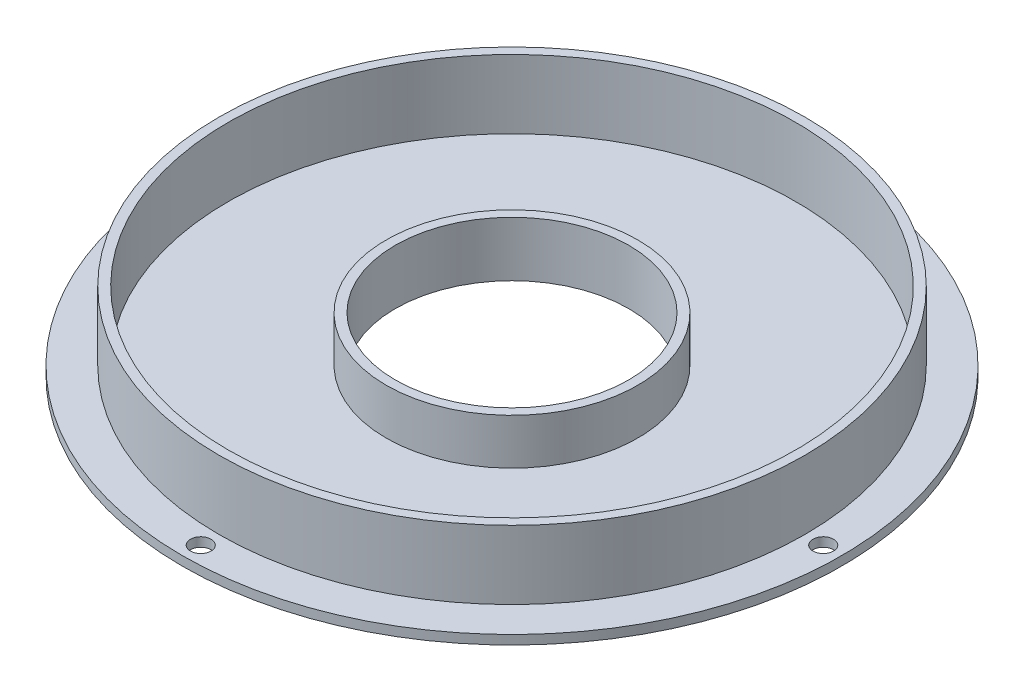
ISO-10303-21;
HEADER;
FILE_DESCRIPTION(('STEP AP214'),'2;1');
FILE_NAME('part.step','',(''),(''),'','','');
FILE_SCHEMA(('AUTOMOTIVE_DESIGN { 1 0 10303 214 1 1 1 1 }'));
ENDSEC;
DATA;
#1=APPLICATION_CONTEXT('core data for automotive mechanical design processes');
#2=APPLICATION_PROTOCOL_DEFINITION('international standard','automotive_design',2000,#1);
#3=PRODUCT_CONTEXT('',#1,'mechanical');
#4=PRODUCT('Part','Part','',(#3));
#5=PRODUCT_RELATED_PRODUCT_CATEGORY('part','',(#4));
#6=PRODUCT_DEFINITION_FORMATION('','',#4);
#7=PRODUCT_DEFINITION_CONTEXT('part definition',#1,'design');
#8=PRODUCT_DEFINITION('design','',#6,#7);
#9=PRODUCT_DEFINITION_SHAPE('','',#8);
#10=(LENGTH_UNIT() NAMED_UNIT(*) SI_UNIT(.MILLI.,.METRE.));
#11=(NAMED_UNIT(*) PLANE_ANGLE_UNIT() SI_UNIT($,.RADIAN.));
#12=(NAMED_UNIT(*) SI_UNIT($,.STERADIAN.) SOLID_ANGLE_UNIT());
#13=UNCERTAINTY_MEASURE_WITH_UNIT(LENGTH_MEASURE(1.E-05),#10,'distance_accuracy_value','');
#14=(GEOMETRIC_REPRESENTATION_CONTEXT(3) GLOBAL_UNCERTAINTY_ASSIGNED_CONTEXT((#13)) GLOBAL_UNIT_ASSIGNED_CONTEXT((#10,
#11,#12)) REPRESENTATION_CONTEXT('',''));
#15=CARTESIAN_POINT('',(0.,0.,0.));
#16=DIRECTION('',(0.,0.,1.));
#17=DIRECTION('',(1.,0.,0.));
#18=AXIS2_PLACEMENT_3D('',#15,#16,#17);
#19=CARTESIAN_POINT('',(0.,2.,0.));
#20=DIRECTION('',(0.,1.,0.));
#21=DIRECTION('',(0.,0.,1.));
#22=AXIS2_PLACEMENT_3D('',#19,#20,#21);
#23=PLANE('',#22);
#24=CARTESIAN_POINT('',(0.,2.,0.));
#25=DIRECTION('',(0.,1.,0.));
#26=DIRECTION('',(0.,0.,1.));
#27=AXIS2_PLACEMENT_3D('',#24,#25,#26);
#28=CIRCLE('',#27,27.5);
#29=CARTESIAN_POINT('',(0.,2.,27.5));
#30=VERTEX_POINT('',#29);
#31=EDGE_CURVE('E94',#30,#30,#28,.T.);
#32=ORIENTED_EDGE('',*,*,#31,.F.);
#33=EDGE_LOOP('',(#32));
#34=FACE_BOUND('',#33,.T.);
#35=CARTESIAN_POINT('',(0.,2.,0.));
#36=DIRECTION('',(0.,1.,0.));
#37=DIRECTION('',(0.,0.,1.));
#38=AXIS2_PLACEMENT_3D('',#35,#36,#37);
#39=CIRCLE('',#38,62.);
#40=CARTESIAN_POINT('',(0.,2.,62.));
#41=VERTEX_POINT('',#40);
#42=EDGE_CURVE('E10',#41,#41,#39,.F.);
#43=ORIENTED_EDGE('',*,*,#42,.F.);
#44=EDGE_LOOP('',(#43));
#45=FACE_BOUND('',#44,.T.);
#46=ADVANCED_FACE('F37',(#34,#45),#23,.T.);
#47=CARTESIAN_POINT('',(0.,2.,0.));
#48=DIRECTION('',(0.,1.,0.));
#49=DIRECTION('',(0.,0.,1.));
#50=AXIS2_PLACEMENT_3D('',#47,#48,#49);
#51=CIRCLE('',#50,64.);
#52=CARTESIAN_POINT('',(0.,2.,64.));
#53=VERTEX_POINT('',#52);
#54=EDGE_CURVE('E106',#53,#53,#51,.T.);
#55=ORIENTED_EDGE('',*,*,#54,.F.);
#56=EDGE_LOOP('',(#55));
#57=FACE_BOUND('',#56,.T.);
#58=CARTESIAN_POINT('',(7.12262193123999E-13,2.,-68.));
#59=DIRECTION('',(0.,1.,0.));
#60=DIRECTION('',(0.,0.,1.));
#61=AXIS2_PLACEMENT_3D('',#58,#59,#60);
#62=CIRCLE('',#61,2.24999999999999);
#63=CARTESIAN_POINT('',(7.12262193123999E-13,2.,-65.75));
#64=VERTEX_POINT('',#63);
#65=EDGE_CURVE('E82',#64,#64,#62,.T.);
#66=ORIENTED_EDGE('',*,*,#65,.F.);
#67=EDGE_LOOP('',(#66));
#68=FACE_BOUND('',#67,.T.);
#69=CARTESIAN_POINT('',(-2.37420731041333E-13,2.,68.));
#70=DIRECTION('',(0.,1.,0.));
#71=DIRECTION('',(0.,0.,1.));
#72=AXIS2_PLACEMENT_3D('',#69,#70,#71);
#73=CIRCLE('',#72,2.24999999999999);
#74=CARTESIAN_POINT('',(-2.37420731041333E-13,2.,70.25));
#75=VERTEX_POINT('',#74);
#76=EDGE_CURVE('E69',#75,#75,#73,.T.);
#77=ORIENTED_EDGE('',*,*,#76,.F.);
#78=EDGE_LOOP('',(#77));
#79=FACE_BOUND('',#78,.T.);
#80=CARTESIAN_POINT('',(68.,2.,0.));
#81=DIRECTION('',(0.,1.,0.));
#82=DIRECTION('',(0.,0.,1.));
#83=AXIS2_PLACEMENT_3D('',#80,#81,#82);
#84=CIRCLE('',#83,2.25);
#85=CARTESIAN_POINT('',(68.,2.,2.25));
#86=VERTEX_POINT('',#85);
#87=EDGE_CURVE('E56',#86,#86,#84,.T.);
#88=ORIENTED_EDGE('',*,*,#87,.F.);
#89=EDGE_LOOP('',(#88));
#90=FACE_BOUND('',#89,.T.);
#91=CARTESIAN_POINT('',(0.,2.,0.));
#92=DIRECTION('',(0.,1.,0.));
#93=DIRECTION('',(0.,0.,1.));
#94=AXIS2_PLACEMENT_3D('',#91,#92,#93);
#95=CIRCLE('',#94,72.);
#96=CARTESIAN_POINT('',(0.,2.,72.));
#97=VERTEX_POINT('',#96);
#98=EDGE_CURVE('E45',#97,#97,#95,.T.);
#99=ORIENTED_EDGE('',*,*,#98,.T.);
#100=EDGE_LOOP('',(#99));
#101=FACE_BOUND('',#100,.T.);
#102=CARTESIAN_POINT('',(-68.,2.,-4.74841462082666E-13));
#103=DIRECTION('',(0.,1.,0.));
#104=DIRECTION('',(0.,0.,1.));
#105=AXIS2_PLACEMENT_3D('',#102,#103,#104);
#106=CIRCLE('',#105,2.24999999999999);
#107=CARTESIAN_POINT('',(-68.,2.,2.24999999999952));
#108=VERTEX_POINT('',#107);
#109=EDGE_CURVE('E74',#108,#108,#106,.T.);
#110=ORIENTED_EDGE('',*,*,#109,.F.);
#111=EDGE_LOOP('',(#110));
#112=FACE_BOUND('',#111,.T.);
#113=ADVANCED_FACE('F137',(#57,#68,#79,#90,#101,#112),#23,.T.);
#114=CARTESIAN_POINT('',(0.,0.,0.));
#115=DIRECTION('',(0.,1.,0.));
#116=DIRECTION('',(0.,0.,1.));
#117=AXIS2_PLACEMENT_3D('',#114,#115,#116);
#118=PLANE('',#117);
#119=CARTESIAN_POINT('',(0.,0.,0.));
#120=DIRECTION('',(0.,1.,0.));
#121=DIRECTION('',(0.,0.,1.));
#122=AXIS2_PLACEMENT_3D('',#119,#120,#121);
#123=CIRCLE('',#122,72.);
#124=CARTESIAN_POINT('',(0.,0.,72.));
#125=VERTEX_POINT('',#124);
#126=EDGE_CURVE('E50',#125,#125,#123,.T.);
#127=ORIENTED_EDGE('',*,*,#126,.F.);
#128=EDGE_LOOP('',(#127));
#129=FACE_BOUND('',#128,.T.);
#130=CARTESIAN_POINT('',(68.,0.,0.));
#131=DIRECTION('',(0.,1.,0.));
#132=DIRECTION('',(0.,0.,1.));
#133=AXIS2_PLACEMENT_3D('',#130,#131,#132);
#134=CIRCLE('',#133,2.25);
#135=CARTESIAN_POINT('',(68.,0.,2.25));
#136=VERTEX_POINT('',#135);
#137=EDGE_CURVE('E58',#136,#136,#134,.T.);
#138=ORIENTED_EDGE('',*,*,#137,.T.);
#139=EDGE_LOOP('',(#138));
#140=FACE_BOUND('',#139,.T.);
#141=CARTESIAN_POINT('',(0.,0.,0.));
#142=DIRECTION('',(0.,1.,0.));
#143=DIRECTION('',(0.,0.,1.));
#144=AXIS2_PLACEMENT_3D('',#141,#142,#143);
#145=CIRCLE('',#144,25.5);
#146=CARTESIAN_POINT('',(0.,0.,25.5));
#147=VERTEX_POINT('',#146);
#148=EDGE_CURVE('E62',#147,#147,#145,.T.);
#149=ORIENTED_EDGE('',*,*,#148,.T.);
#150=EDGE_LOOP('',(#149));
#151=FACE_BOUND('',#150,.T.);
#152=CARTESIAN_POINT('',(-2.37420731041333E-13,0.,68.));
#153=DIRECTION('',(0.,1.,0.));
#154=DIRECTION('',(0.,0.,1.));
#155=AXIS2_PLACEMENT_3D('',#152,#153,#154);
#156=CIRCLE('',#155,2.24999999999999);
#157=CARTESIAN_POINT('',(-2.37420731041333E-13,0.,70.25));
#158=VERTEX_POINT('',#157);
#159=EDGE_CURVE('E70',#158,#158,#156,.T.);
#160=ORIENTED_EDGE('',*,*,#159,.T.);
#161=EDGE_LOOP('',(#160));
#162=FACE_BOUND('',#161,.T.);
#163=CARTESIAN_POINT('',(-68.,0.,-4.74841462082666E-13));
#164=DIRECTION('',(0.,1.,0.));
#165=DIRECTION('',(0.,0.,1.));
#166=AXIS2_PLACEMENT_3D('',#163,#164,#165);
#167=CIRCLE('',#166,2.24999999999999);
#168=CARTESIAN_POINT('',(-68.,0.,2.24999999999952));
#169=VERTEX_POINT('',#168);
#170=EDGE_CURVE('E78',#169,#169,#167,.T.);
#171=ORIENTED_EDGE('',*,*,#170,.T.);
#172=EDGE_LOOP('',(#171));
#173=FACE_BOUND('',#172,.T.);
#174=CARTESIAN_POINT('',(7.12262193123999E-13,0.,-68.));
#175=DIRECTION('',(0.,1.,0.));
#176=DIRECTION('',(0.,0.,1.));
#177=AXIS2_PLACEMENT_3D('',#174,#175,#176);
#178=CIRCLE('',#177,2.24999999999999);
#179=CARTESIAN_POINT('',(7.12262193123999E-13,0.,-65.75));
#180=VERTEX_POINT('',#179);
#181=EDGE_CURVE('E86',#180,#180,#178,.T.);
#182=ORIENTED_EDGE('',*,*,#181,.T.);
#183=EDGE_LOOP('',(#182));
#184=FACE_BOUND('',#183,.T.);
#185=ADVANCED_FACE('F143',(#129,#140,#151,#162,#173,#184),#118,.F.);
#186=CARTESIAN_POINT('',(0.,2.,0.));
#187=DIRECTION('',(0.,-1.,0.));
#188=DIRECTION('',(0.,0.,-1.));
#189=AXIS2_PLACEMENT_3D('',#186,#187,#188);
#190=CYLINDRICAL_SURFACE('',#189,72.);
#191=ORIENTED_EDGE('',*,*,#98,.F.);
#192=EDGE_LOOP('',(#191));
#193=FACE_BOUND('',#192,.T.);
#194=ORIENTED_EDGE('',*,*,#126,.T.);
#195=EDGE_LOOP('',(#194));
#196=FACE_BOUND('',#195,.T.);
#197=ADVANCED_FACE('F39',(#193,#196),#190,.T.);
#198=CARTESIAN_POINT('',(68.,2.,0.));
#199=DIRECTION('',(0.,-1.,0.));
#200=DIRECTION('',(0.,0.,-1.));
#201=AXIS2_PLACEMENT_3D('',#198,#199,#200);
#202=CYLINDRICAL_SURFACE('',#201,2.25);
#203=ORIENTED_EDGE('',*,*,#87,.T.);
#204=EDGE_LOOP('',(#203));
#205=FACE_BOUND('',#204,.T.);
#206=ORIENTED_EDGE('',*,*,#137,.F.);
#207=EDGE_LOOP('',(#206));
#208=FACE_BOUND('',#207,.T.);
#209=ADVANCED_FACE('F148',(#205,#208),#202,.F.);
#210=CARTESIAN_POINT('',(0.,2.,0.));
#211=DIRECTION('',(0.,-1.,0.));
#212=DIRECTION('',(0.,0.,-1.));
#213=AXIS2_PLACEMENT_3D('',#210,#211,#212);
#214=CYLINDRICAL_SURFACE('',#213,25.5);
#215=ORIENTED_EDGE('',*,*,#148,.F.);
#216=EDGE_LOOP('',(#215));
#217=FACE_BOUND('',#216,.T.);
#218=CARTESIAN_POINT('',(0.,12.,0.));
#219=DIRECTION('',(0.,1.,0.));
#220=DIRECTION('',(0.,0.,1.));
#221=AXIS2_PLACEMENT_3D('',#218,#219,#220);
#222=CIRCLE('',#221,25.5);
#223=CARTESIAN_POINT('',(0.,12.,25.5));
#224=VERTEX_POINT('',#223);
#225=EDGE_CURVE('E98',#224,#224,#222,.T.);
#226=ORIENTED_EDGE('',*,*,#225,.T.);
#227=EDGE_LOOP('',(#226));
#228=FACE_BOUND('',#227,.T.);
#229=ADVANCED_FACE('F184',(#217,#228),#214,.F.);
#230=CARTESIAN_POINT('',(-2.37420731041333E-13,2.,68.));
#231=DIRECTION('',(0.,-1.,0.));
#232=DIRECTION('',(0.,0.,-1.));
#233=AXIS2_PLACEMENT_3D('',#230,#231,#232);
#234=CYLINDRICAL_SURFACE('',#233,2.24999999999999);
#235=ORIENTED_EDGE('',*,*,#76,.T.);
#236=EDGE_LOOP('',(#235));
#237=FACE_BOUND('',#236,.T.);
#238=ORIENTED_EDGE('',*,*,#159,.F.);
#239=EDGE_LOOP('',(#238));
#240=FACE_BOUND('',#239,.T.);
#241=ADVANCED_FACE('F179',(#237,#240),#234,.F.);
#242=CARTESIAN_POINT('',(-68.,2.,-4.74841462082666E-13));
#243=DIRECTION('',(0.,-1.,0.));
#244=DIRECTION('',(0.,0.,-1.));
#245=AXIS2_PLACEMENT_3D('',#242,#243,#244);
#246=CYLINDRICAL_SURFACE('',#245,2.24999999999999);
#247=ORIENTED_EDGE('',*,*,#109,.T.);
#248=EDGE_LOOP('',(#247));
#249=FACE_BOUND('',#248,.T.);
#250=ORIENTED_EDGE('',*,*,#170,.F.);
#251=EDGE_LOOP('',(#250));
#252=FACE_BOUND('',#251,.T.);
#253=ADVANCED_FACE('F170',(#249,#252),#246,.F.);
#254=CARTESIAN_POINT('',(7.12262193123999E-13,2.,-68.));
#255=DIRECTION('',(0.,-1.,0.));
#256=DIRECTION('',(0.,0.,-1.));
#257=AXIS2_PLACEMENT_3D('',#254,#255,#256);
#258=CYLINDRICAL_SURFACE('',#257,2.24999999999999);
#259=ORIENTED_EDGE('',*,*,#65,.T.);
#260=EDGE_LOOP('',(#259));
#261=FACE_BOUND('',#260,.T.);
#262=ORIENTED_EDGE('',*,*,#181,.F.);
#263=EDGE_LOOP('',(#262));
#264=FACE_BOUND('',#263,.T.);
#265=ADVANCED_FACE('F168',(#261,#264),#258,.F.);
#266=CARTESIAN_POINT('',(0.,12.,0.));
#267=DIRECTION('',(0.,1.,0.));
#268=DIRECTION('',(0.,0.,1.));
#269=AXIS2_PLACEMENT_3D('',#266,#267,#268);
#270=PLANE('',#269);
#271=CARTESIAN_POINT('',(0.,12.,0.));
#272=DIRECTION('',(0.,1.,0.));
#273=DIRECTION('',(0.,0.,1.));
#274=AXIS2_PLACEMENT_3D('',#271,#272,#273);
#275=CIRCLE('',#274,27.5);
#276=CARTESIAN_POINT('',(0.,12.,27.5));
#277=VERTEX_POINT('',#276);
#278=EDGE_CURVE('E90',#277,#277,#275,.T.);
#279=ORIENTED_EDGE('',*,*,#278,.T.);
#280=EDGE_LOOP('',(#279));
#281=FACE_BOUND('',#280,.T.);
#282=ORIENTED_EDGE('',*,*,#225,.F.);
#283=EDGE_LOOP('',(#282));
#284=FACE_BOUND('',#283,.T.);
#285=ADVANCED_FACE('F132',(#281,#284),#270,.T.);
#286=CARTESIAN_POINT('',(0.,12.,0.));
#287=DIRECTION('',(0.,-1.,0.));
#288=DIRECTION('',(0.,0.,-1.));
#289=AXIS2_PLACEMENT_3D('',#286,#287,#288);
#290=CYLINDRICAL_SURFACE('',#289,27.5);
#291=ORIENTED_EDGE('',*,*,#278,.F.);
#292=EDGE_LOOP('',(#291));
#293=FACE_BOUND('',#292,.T.);
#294=ORIENTED_EDGE('',*,*,#31,.T.);
#295=EDGE_LOOP('',(#294));
#296=FACE_BOUND('',#295,.T.);
#297=ADVANCED_FACE('F123',(#293,#296),#290,.T.);
#298=CARTESIAN_POINT('',(0.,17.,0.));
#299=DIRECTION('',(0.,1.,0.));
#300=DIRECTION('',(0.,0.,1.));
#301=AXIS2_PLACEMENT_3D('',#298,#299,#300);
#302=PLANE('',#301);
#303=CARTESIAN_POINT('',(0.,17.,0.));
#304=DIRECTION('',(0.,1.,0.));
#305=DIRECTION('',(0.,0.,1.));
#306=AXIS2_PLACEMENT_3D('',#303,#304,#305);
#307=CIRCLE('',#306,64.);
#308=CARTESIAN_POINT('',(0.,17.,64.));
#309=VERTEX_POINT('',#308);
#310=EDGE_CURVE('E105',#309,#309,#307,.T.);
#311=ORIENTED_EDGE('',*,*,#310,.T.);
#312=EDGE_LOOP('',(#311));
#313=FACE_BOUND('',#312,.T.);
#314=CARTESIAN_POINT('',(0.,17.,0.));
#315=DIRECTION('',(0.,1.,0.));
#316=DIRECTION('',(0.,0.,1.));
#317=AXIS2_PLACEMENT_3D('',#314,#315,#316);
#318=CIRCLE('',#317,62.);
#319=CARTESIAN_POINT('',(0.,17.,62.));
#320=VERTEX_POINT('',#319);
#321=EDGE_CURVE('E110',#320,#320,#318,.T.);
#322=ORIENTED_EDGE('',*,*,#321,.F.);
#323=EDGE_LOOP('',(#322));
#324=FACE_BOUND('',#323,.T.);
#325=ADVANCED_FACE('F120',(#313,#324),#302,.T.);
#326=CARTESIAN_POINT('',(0.,17.,0.));
#327=DIRECTION('',(0.,-1.,0.));
#328=DIRECTION('',(0.,0.,-1.));
#329=AXIS2_PLACEMENT_3D('',#326,#327,#328);
#330=CYLINDRICAL_SURFACE('',#329,64.);
#331=ORIENTED_EDGE('',*,*,#310,.F.);
#332=EDGE_LOOP('',(#331));
#333=FACE_BOUND('',#332,.T.);
#334=ORIENTED_EDGE('',*,*,#54,.T.);
#335=EDGE_LOOP('',(#334));
#336=FACE_BOUND('',#335,.T.);
#337=ADVANCED_FACE('F122',(#333,#336),#330,.T.);
#338=CARTESIAN_POINT('',(0.,17.,0.));
#339=DIRECTION('',(0.,-1.,0.));
#340=DIRECTION('',(0.,0.,-1.));
#341=AXIS2_PLACEMENT_3D('',#338,#339,#340);
#342=CYLINDRICAL_SURFACE('',#341,62.);
#343=ORIENTED_EDGE('',*,*,#321,.T.);
#344=EDGE_LOOP('',(#343));
#345=FACE_BOUND('',#344,.T.);
#346=ORIENTED_EDGE('',*,*,#42,.T.);
#347=EDGE_LOOP('',(#346));
#348=FACE_BOUND('',#347,.T.);
#349=ADVANCED_FACE('F118',(#345,#348),#342,.F.);
#350=CLOSED_SHELL('',(#46,#113,#185,#197,#209,#229,#241,#253,#265,#285,#297,#325,#337,#349));
#351=MANIFOLD_SOLID_BREP('B2',#350);
#352=ADVANCED_BREP_SHAPE_REPRESENTATION('',(#18,#351),#14);
#353=SHAPE_DEFINITION_REPRESENTATION(#9,#352);
ENDSEC;
END-ISO-10303-21;
